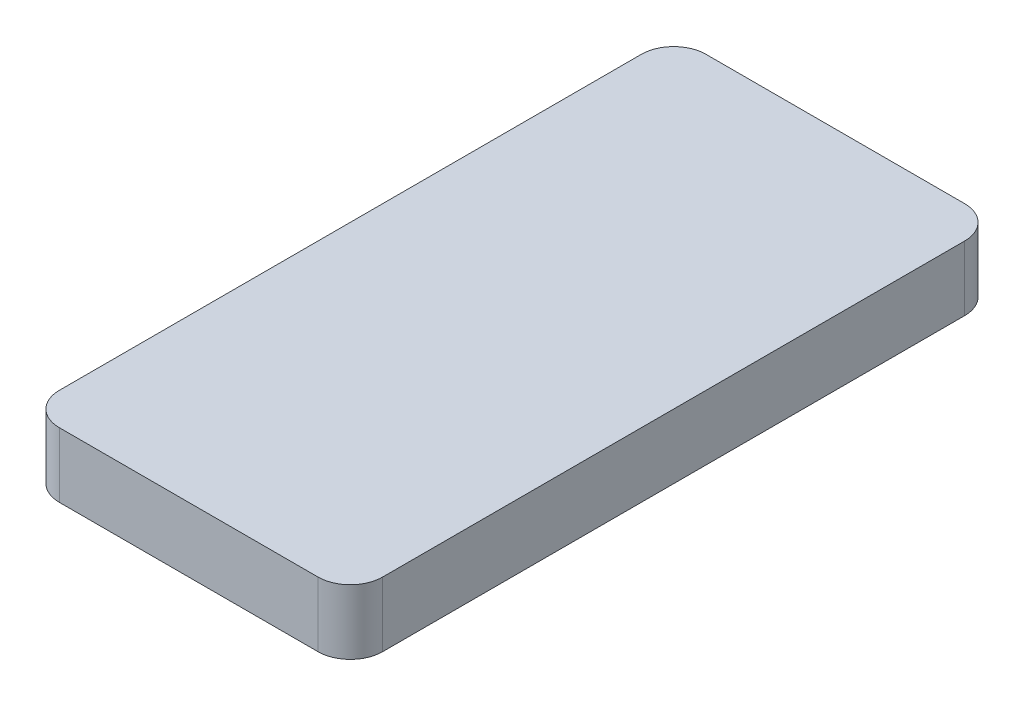
ISO-10303-21;
HEADER;
FILE_DESCRIPTION(('STEP AP214'),'2;1');
FILE_NAME('part.step','',(''),(''),'','','');
FILE_SCHEMA(('AUTOMOTIVE_DESIGN { 1 0 10303 214 1 1 1 1 }'));
ENDSEC;
DATA;
#1=APPLICATION_CONTEXT('core data for automotive mechanical design processes');
#2=APPLICATION_PROTOCOL_DEFINITION('international standard','automotive_design',2000,#1);
#3=PRODUCT_CONTEXT('',#1,'mechanical');
#4=PRODUCT('Part','Part','',(#3));
#5=PRODUCT_RELATED_PRODUCT_CATEGORY('part','',(#4));
#6=PRODUCT_DEFINITION_FORMATION('','',#4);
#7=PRODUCT_DEFINITION_CONTEXT('part definition',#1,'design');
#8=PRODUCT_DEFINITION('design','',#6,#7);
#9=PRODUCT_DEFINITION_SHAPE('','',#8);
#10=(LENGTH_UNIT() NAMED_UNIT(*) SI_UNIT(.MILLI.,.METRE.));
#11=(NAMED_UNIT(*) PLANE_ANGLE_UNIT() SI_UNIT($,.RADIAN.));
#12=(NAMED_UNIT(*) SI_UNIT($,.STERADIAN.) SOLID_ANGLE_UNIT());
#13=UNCERTAINTY_MEASURE_WITH_UNIT(LENGTH_MEASURE(1.E-05),#10,'distance_accuracy_value','');
#14=(GEOMETRIC_REPRESENTATION_CONTEXT(3) GLOBAL_UNCERTAINTY_ASSIGNED_CONTEXT((#13)) GLOBAL_UNIT_ASSIGNED_CONTEXT((#10,
#11,#12)) REPRESENTATION_CONTEXT('',''));
#15=CARTESIAN_POINT('',(0.,0.,0.));
#16=DIRECTION('',(0.,0.,1.));
#17=DIRECTION('',(1.,0.,0.));
#18=AXIS2_PLACEMENT_3D('',#15,#16,#17);
#19=CARTESIAN_POINT('',(40.,20.,90.));
#20=DIRECTION('',(0.,-1.,0.));
#21=DIRECTION('',(0.,0.,-1.));
#22=AXIS2_PLACEMENT_3D('',#19,#20,#21);
#23=CYLINDRICAL_SURFACE('',#22,10.);
#24=CARTESIAN_POINT('',(40.,0.,90.));
#25=DIRECTION('',(0.,1.,0.));
#26=DIRECTION('',(0.,0.,1.));
#27=AXIS2_PLACEMENT_3D('',#24,#25,#26);
#28=CIRCLE('',#27,10.);
#29=CARTESIAN_POINT('',(40.,0.,100.));
#30=VERTEX_POINT('',#29);
#31=CARTESIAN_POINT('',(50.,0.,90.));
#32=VERTEX_POINT('',#31);
#33=EDGE_CURVE('E129',#30,#32,#28,.T.);
#34=ORIENTED_EDGE('',*,*,#33,.T.);
#35=DIRECTION('',(0.,-1.,0.));
#36=VECTOR('',#35,1.);
#37=CARTESIAN_POINT('',(50.,20.,90.));
#38=LINE('',#37,#36);
#39=CARTESIAN_POINT('',(50.,20.,90.));
#40=VERTEX_POINT('',#39);
#41=EDGE_CURVE('E11',#40,#32,#38,.T.);
#42=ORIENTED_EDGE('',*,*,#41,.F.);
#43=CARTESIAN_POINT('',(40.,20.,90.));
#44=DIRECTION('',(0.,1.,0.));
#45=DIRECTION('',(0.,0.,1.));
#46=AXIS2_PLACEMENT_3D('',#43,#44,#45);
#47=CIRCLE('',#46,10.);
#48=CARTESIAN_POINT('',(40.,20.,100.));
#49=VERTEX_POINT('',#48);
#50=EDGE_CURVE('E143',#49,#40,#47,.T.);
#51=ORIENTED_EDGE('',*,*,#50,.F.);
#52=DIRECTION('',(0.,-1.,0.));
#53=VECTOR('',#52,1.);
#54=CARTESIAN_POINT('',(40.,20.,100.));
#55=LINE('',#54,#53);
#56=EDGE_CURVE('E125',#49,#30,#55,.T.);
#57=ORIENTED_EDGE('',*,*,#56,.T.);
#58=EDGE_LOOP('',(#34,#42,#51,#57));
#59=FACE_BOUND('',#58,.T.);
#60=ADVANCED_FACE('F33',(#59),#23,.T.);
#61=CARTESIAN_POINT('',(50.,20.,90.));
#62=DIRECTION('',(-1.,0.,0.));
#63=DIRECTION('',(0.,0.,1.));
#64=AXIS2_PLACEMENT_3D('',#61,#62,#63);
#65=PLANE('',#64);
#66=DIRECTION('',(0.,0.,-1.));
#67=VECTOR('',#66,1.);
#68=CARTESIAN_POINT('',(50.,0.,90.));
#69=LINE('',#68,#67);
#70=CARTESIAN_POINT('',(50.,0.,-90.));
#71=VERTEX_POINT('',#70);
#72=EDGE_CURVE('E132',#32,#71,#69,.T.);
#73=ORIENTED_EDGE('',*,*,#72,.T.);
#74=DIRECTION('',(0.,-1.,0.));
#75=VECTOR('',#74,1.);
#76=CARTESIAN_POINT('',(50.,20.,-90.));
#77=LINE('',#76,#75);
#78=CARTESIAN_POINT('',(50.,20.,-90.));
#79=VERTEX_POINT('',#78);
#80=EDGE_CURVE('E41',#79,#71,#77,.T.);
#81=ORIENTED_EDGE('',*,*,#80,.F.);
#82=DIRECTION('',(0.,0.,-1.));
#83=VECTOR('',#82,1.);
#84=CARTESIAN_POINT('',(50.,20.,90.));
#85=LINE('',#84,#83);
#86=EDGE_CURVE('E92',#40,#79,#85,.T.);
#87=ORIENTED_EDGE('',*,*,#86,.F.);
#88=ORIENTED_EDGE('',*,*,#41,.T.);
#89=EDGE_LOOP('',(#73,#81,#87,#88));
#90=FACE_BOUND('',#89,.T.);
#91=ADVANCED_FACE('F178',(#90),#65,.F.);
#92=CARTESIAN_POINT('',(40.,20.,-90.));
#93=DIRECTION('',(0.,-1.,0.));
#94=DIRECTION('',(0.,0.,-1.));
#95=AXIS2_PLACEMENT_3D('',#92,#93,#94);
#96=CYLINDRICAL_SURFACE('',#95,10.);
#97=CARTESIAN_POINT('',(40.,0.,-90.));
#98=DIRECTION('',(0.,1.,0.));
#99=DIRECTION('',(0.,0.,-1.));
#100=AXIS2_PLACEMENT_3D('',#97,#98,#99);
#101=CIRCLE('',#100,10.);
#102=CARTESIAN_POINT('',(40.,0.,-100.));
#103=VERTEX_POINT('',#102);
#104=EDGE_CURVE('E134',#71,#103,#101,.T.);
#105=ORIENTED_EDGE('',*,*,#104,.T.);
#106=DIRECTION('',(0.,-1.,0.));
#107=VECTOR('',#106,1.);
#108=CARTESIAN_POINT('',(40.,20.,-100.));
#109=LINE('',#108,#107);
#110=CARTESIAN_POINT('',(40.,20.,-100.));
#111=VERTEX_POINT('',#110);
#112=EDGE_CURVE('E150',#111,#103,#109,.T.);
#113=ORIENTED_EDGE('',*,*,#112,.F.);
#114=CARTESIAN_POINT('',(40.,20.,-90.));
#115=DIRECTION('',(0.,1.,0.));
#116=DIRECTION('',(0.,0.,-1.));
#117=AXIS2_PLACEMENT_3D('',#114,#115,#116);
#118=CIRCLE('',#117,10.);
#119=EDGE_CURVE('E158',#79,#111,#118,.T.);
#120=ORIENTED_EDGE('',*,*,#119,.F.);
#121=ORIENTED_EDGE('',*,*,#80,.T.);
#122=EDGE_LOOP('',(#105,#113,#120,#121));
#123=FACE_BOUND('',#122,.T.);
#124=ADVANCED_FACE('F156',(#123),#96,.T.);
#125=CARTESIAN_POINT('',(-40.,20.,-100.));
#126=DIRECTION('',(0.,0.,1.));
#127=DIRECTION('',(1.,0.,0.));
#128=AXIS2_PLACEMENT_3D('',#125,#126,#127);
#129=PLANE('',#128);
#130=DIRECTION('',(-1.,0.,0.));
#131=VECTOR('',#130,1.);
#132=CARTESIAN_POINT('',(-40.,0.,-100.));
#133=LINE('',#132,#131);
#134=CARTESIAN_POINT('',(-40.,0.,-100.));
#135=VERTEX_POINT('',#134);
#136=EDGE_CURVE('E136',#103,#135,#133,.T.);
#137=ORIENTED_EDGE('',*,*,#136,.T.);
#138=DIRECTION('',(0.,-1.,0.));
#139=VECTOR('',#138,1.);
#140=CARTESIAN_POINT('',(-40.,20.,-100.));
#141=LINE('',#140,#139);
#142=CARTESIAN_POINT('',(-40.,20.,-100.));
#143=VERTEX_POINT('',#142);
#144=EDGE_CURVE('E147',#143,#135,#141,.T.);
#145=ORIENTED_EDGE('',*,*,#144,.F.);
#146=DIRECTION('',(-1.,0.,0.));
#147=VECTOR('',#146,1.);
#148=CARTESIAN_POINT('',(-40.,20.,-100.));
#149=LINE('',#148,#147);
#150=EDGE_CURVE('E170',#111,#143,#149,.T.);
#151=ORIENTED_EDGE('',*,*,#150,.F.);
#152=ORIENTED_EDGE('',*,*,#112,.T.);
#153=EDGE_LOOP('',(#137,#145,#151,#152));
#154=FACE_BOUND('',#153,.T.);
#155=ADVANCED_FACE('F166',(#154),#129,.F.);
#156=CARTESIAN_POINT('',(-40.,20.,-90.));
#157=DIRECTION('',(0.,-1.,0.));
#158=DIRECTION('',(0.,0.,-1.));
#159=AXIS2_PLACEMENT_3D('',#156,#157,#158);
#160=CYLINDRICAL_SURFACE('',#159,10.);
#161=CARTESIAN_POINT('',(-40.,0.,-90.));
#162=DIRECTION('',(0.,1.,0.));
#163=DIRECTION('',(0.,0.,-1.));
#164=AXIS2_PLACEMENT_3D('',#161,#162,#163);
#165=CIRCLE('',#164,10.);
#166=CARTESIAN_POINT('',(-50.,0.,-90.));
#167=VERTEX_POINT('',#166);
#168=EDGE_CURVE('E138',#135,#167,#165,.T.);
#169=ORIENTED_EDGE('',*,*,#168,.T.);
#170=DIRECTION('',(0.,-1.,0.));
#171=VECTOR('',#170,1.);
#172=CARTESIAN_POINT('',(-50.,20.,-90.));
#173=LINE('',#172,#171);
#174=CARTESIAN_POINT('',(-50.,20.,-90.));
#175=VERTEX_POINT('',#174);
#176=EDGE_CURVE('E120',#175,#167,#173,.T.);
#177=ORIENTED_EDGE('',*,*,#176,.F.);
#178=CARTESIAN_POINT('',(-40.,20.,-90.));
#179=DIRECTION('',(0.,1.,0.));
#180=DIRECTION('',(0.,0.,-1.));
#181=AXIS2_PLACEMENT_3D('',#178,#179,#180);
#182=CIRCLE('',#181,10.);
#183=EDGE_CURVE('E111',#143,#175,#182,.T.);
#184=ORIENTED_EDGE('',*,*,#183,.F.);
#185=ORIENTED_EDGE('',*,*,#144,.T.);
#186=EDGE_LOOP('',(#169,#177,#184,#185));
#187=FACE_BOUND('',#186,.T.);
#188=ADVANCED_FACE('F169',(#187),#160,.T.);
#189=CARTESIAN_POINT('',(-50.,20.,90.));
#190=DIRECTION('',(1.,0.,0.));
#191=DIRECTION('',(0.,0.,-1.));
#192=AXIS2_PLACEMENT_3D('',#189,#190,#191);
#193=PLANE('',#192);
#194=DIRECTION('',(0.,0.,1.));
#195=VECTOR('',#194,1.);
#196=CARTESIAN_POINT('',(-50.,0.,90.));
#197=LINE('',#196,#195);
#198=CARTESIAN_POINT('',(-50.,0.,90.));
#199=VERTEX_POINT('',#198);
#200=EDGE_CURVE('E119',#167,#199,#197,.T.);
#201=ORIENTED_EDGE('',*,*,#200,.T.);
#202=DIRECTION('',(0.,-1.,0.));
#203=VECTOR('',#202,1.);
#204=CARTESIAN_POINT('',(-50.,20.,90.));
#205=LINE('',#204,#203);
#206=CARTESIAN_POINT('',(-50.,20.,90.));
#207=VERTEX_POINT('',#206);
#208=EDGE_CURVE('E116',#207,#199,#205,.T.);
#209=ORIENTED_EDGE('',*,*,#208,.F.);
#210=DIRECTION('',(0.,0.,1.));
#211=VECTOR('',#210,1.);
#212=CARTESIAN_POINT('',(-50.,20.,90.));
#213=LINE('',#212,#211);
#214=EDGE_CURVE('E105',#175,#207,#213,.T.);
#215=ORIENTED_EDGE('',*,*,#214,.F.);
#216=ORIENTED_EDGE('',*,*,#176,.T.);
#217=EDGE_LOOP('',(#201,#209,#215,#216));
#218=FACE_BOUND('',#217,.T.);
#219=ADVANCED_FACE('F117',(#218),#193,.F.);
#220=CARTESIAN_POINT('',(-40.,20.,90.));
#221=DIRECTION('',(0.,-1.,0.));
#222=DIRECTION('',(0.,0.,-1.));
#223=AXIS2_PLACEMENT_3D('',#220,#221,#222);
#224=CYLINDRICAL_SURFACE('',#223,10.);
#225=CARTESIAN_POINT('',(-40.,0.,90.));
#226=DIRECTION('',(0.,1.,0.));
#227=DIRECTION('',(0.,0.,-1.));
#228=AXIS2_PLACEMENT_3D('',#225,#226,#227);
#229=CIRCLE('',#228,10.);
#230=CARTESIAN_POINT('',(-40.,0.,100.));
#231=VERTEX_POINT('',#230);
#232=EDGE_CURVE('E78',#199,#231,#229,.T.);
#233=ORIENTED_EDGE('',*,*,#232,.T.);
#234=DIRECTION('',(0.,-1.,0.));
#235=VECTOR('',#234,1.);
#236=CARTESIAN_POINT('',(-40.,20.,100.));
#237=LINE('',#236,#235);
#238=CARTESIAN_POINT('',(-40.,20.,100.));
#239=VERTEX_POINT('',#238);
#240=EDGE_CURVE('E121',#239,#231,#237,.T.);
#241=ORIENTED_EDGE('',*,*,#240,.F.);
#242=CARTESIAN_POINT('',(-40.,20.,90.));
#243=DIRECTION('',(0.,1.,0.));
#244=DIRECTION('',(0.,0.,-1.));
#245=AXIS2_PLACEMENT_3D('',#242,#243,#244);
#246=CIRCLE('',#245,10.);
#247=EDGE_CURVE('E109',#207,#239,#246,.T.);
#248=ORIENTED_EDGE('',*,*,#247,.F.);
#249=ORIENTED_EDGE('',*,*,#208,.T.);
#250=EDGE_LOOP('',(#233,#241,#248,#249));
#251=FACE_BOUND('',#250,.T.);
#252=ADVANCED_FACE('F123',(#251),#224,.T.);
#253=CARTESIAN_POINT('',(-40.,20.,100.));
#254=DIRECTION('',(0.,0.,-1.));
#255=DIRECTION('',(-1.,0.,0.));
#256=AXIS2_PLACEMENT_3D('',#253,#254,#255);
#257=PLANE('',#256);
#258=DIRECTION('',(1.,0.,0.));
#259=VECTOR('',#258,1.);
#260=CARTESIAN_POINT('',(-40.,0.,100.));
#261=LINE('',#260,#259);
#262=EDGE_CURVE('E84',#231,#30,#261,.T.);
#263=ORIENTED_EDGE('',*,*,#262,.T.);
#264=ORIENTED_EDGE('',*,*,#56,.F.);
#265=DIRECTION('',(1.,0.,0.));
#266=VECTOR('',#265,1.);
#267=CARTESIAN_POINT('',(-40.,20.,100.));
#268=LINE('',#267,#266);
#269=EDGE_CURVE('E49',#239,#49,#268,.T.);
#270=ORIENTED_EDGE('',*,*,#269,.F.);
#271=ORIENTED_EDGE('',*,*,#240,.T.);
#272=EDGE_LOOP('',(#263,#264,#270,#271));
#273=FACE_BOUND('',#272,.T.);
#274=ADVANCED_FACE('F194',(#273),#257,.F.);
#275=CARTESIAN_POINT('',(40.,20.,90.));
#276=DIRECTION('',(0.,1.,0.));
#277=DIRECTION('',(0.,0.,1.));
#278=AXIS2_PLACEMENT_3D('',#275,#276,#277);
#279=PLANE('',#278);
#280=ORIENTED_EDGE('',*,*,#50,.T.);
#281=ORIENTED_EDGE('',*,*,#86,.T.);
#282=ORIENTED_EDGE('',*,*,#119,.T.);
#283=ORIENTED_EDGE('',*,*,#150,.T.);
#284=ORIENTED_EDGE('',*,*,#183,.T.);
#285=ORIENTED_EDGE('',*,*,#214,.T.);
#286=ORIENTED_EDGE('',*,*,#247,.T.);
#287=ORIENTED_EDGE('',*,*,#269,.T.);
#288=EDGE_LOOP('',(#280,#281,#282,#283,#284,#285,#286,#287));
#289=FACE_BOUND('',#288,.T.);
#290=ADVANCED_FACE('F107',(#289),#279,.T.);
#291=CARTESIAN_POINT('',(40.,0.,90.));
#292=DIRECTION('',(0.,1.,0.));
#293=DIRECTION('',(0.,0.,1.));
#294=AXIS2_PLACEMENT_3D('',#291,#292,#293);
#295=PLANE('',#294);
#296=ORIENTED_EDGE('',*,*,#33,.F.);
#297=ORIENTED_EDGE('',*,*,#262,.F.);
#298=ORIENTED_EDGE('',*,*,#232,.F.);
#299=ORIENTED_EDGE('',*,*,#200,.F.);
#300=ORIENTED_EDGE('',*,*,#168,.F.);
#301=ORIENTED_EDGE('',*,*,#136,.F.);
#302=ORIENTED_EDGE('',*,*,#104,.F.);
#303=ORIENTED_EDGE('',*,*,#72,.F.);
#304=EDGE_LOOP('',(#296,#297,#298,#299,#300,#301,#302,#303));
#305=FACE_BOUND('',#304,.T.);
#306=ADVANCED_FACE('F162',(#305),#295,.F.);
#307=CLOSED_SHELL('',(#60,#91,#124,#155,#188,#219,#252,#274,#290,#306));
#308=MANIFOLD_SOLID_BREP('B2',#307);
#309=ADVANCED_BREP_SHAPE_REPRESENTATION('',(#18,#308),#14);
#310=SHAPE_DEFINITION_REPRESENTATION(#9,#309);
ENDSEC;
END-ISO-10303-21;
